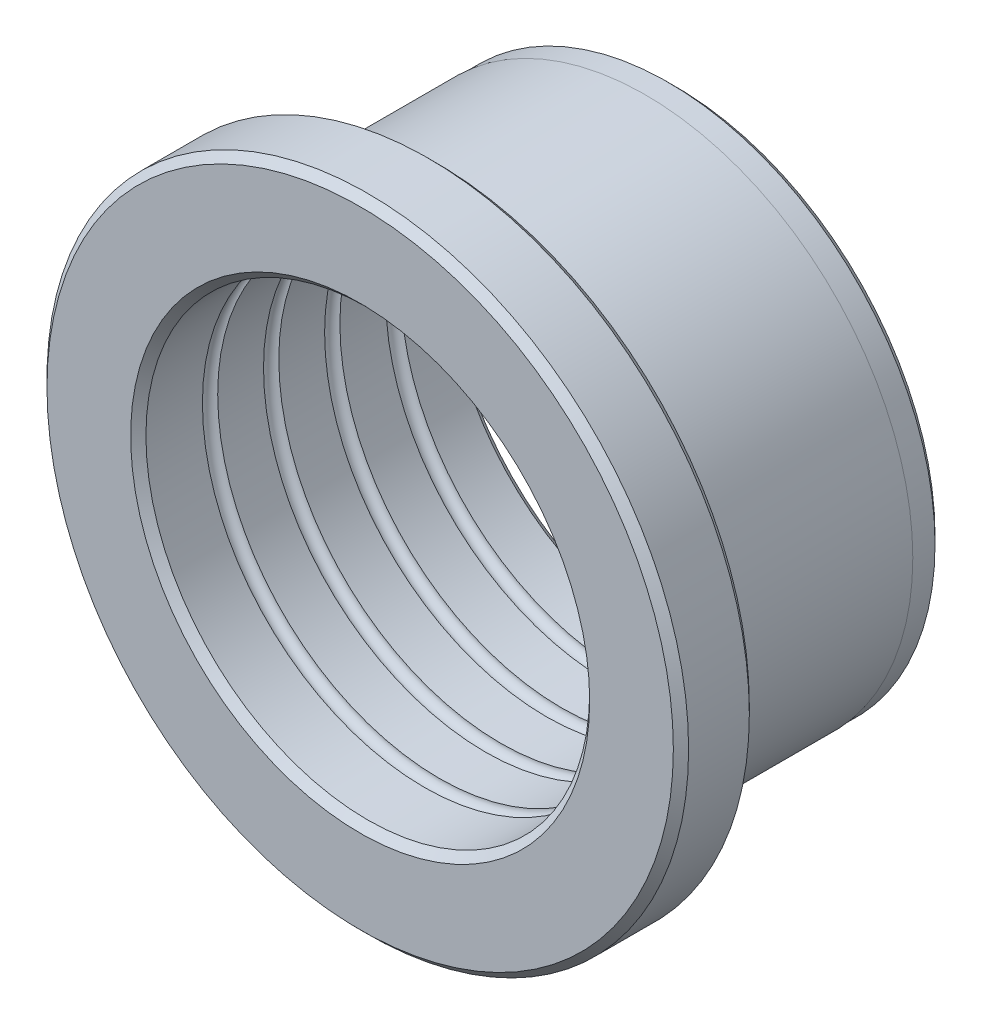
ISO-10303-21;
HEADER;
FILE_DESCRIPTION(('STEP AP214'),'2;1');
FILE_NAME('part.step','',(''),(''),'','','');
FILE_SCHEMA(('AUTOMOTIVE_DESIGN { 1 0 10303 214 1 1 1 1 }'));
ENDSEC;
DATA;
#1=APPLICATION_CONTEXT('core data for automotive mechanical design processes');
#2=APPLICATION_PROTOCOL_DEFINITION('international standard','automotive_design',2000,#1);
#3=PRODUCT_CONTEXT('',#1,'mechanical');
#4=PRODUCT('Part','Part','',(#3));
#5=PRODUCT_RELATED_PRODUCT_CATEGORY('part','',(#4));
#6=PRODUCT_DEFINITION_FORMATION('','',#4);
#7=PRODUCT_DEFINITION_CONTEXT('part definition',#1,'design');
#8=PRODUCT_DEFINITION('design','',#6,#7);
#9=PRODUCT_DEFINITION_SHAPE('','',#8);
#10=(LENGTH_UNIT() NAMED_UNIT(*) SI_UNIT(.MILLI.,.METRE.));
#11=(NAMED_UNIT(*) PLANE_ANGLE_UNIT() SI_UNIT($,.RADIAN.));
#12=(NAMED_UNIT(*) SI_UNIT($,.STERADIAN.) SOLID_ANGLE_UNIT());
#13=UNCERTAINTY_MEASURE_WITH_UNIT(LENGTH_MEASURE(1.E-05),#10,'distance_accuracy_value','');
#14=(GEOMETRIC_REPRESENTATION_CONTEXT(3) GLOBAL_UNCERTAINTY_ASSIGNED_CONTEXT((#13)) GLOBAL_UNIT_ASSIGNED_CONTEXT((#10,
#11,#12)) REPRESENTATION_CONTEXT('',''));
#15=CARTESIAN_POINT('',(0.,0.,0.));
#16=DIRECTION('',(0.,0.,1.));
#17=DIRECTION('',(1.,0.,0.));
#18=AXIS2_PLACEMENT_3D('',#15,#16,#17);
#19=CARTESIAN_POINT('',(0.,0.,-4.7));
#20=DIRECTION('',(0.,0.,1.));
#21=DIRECTION('',(1.,0.,0.));
#22=AXIS2_PLACEMENT_3D('',#19,#20,#21);
#23=TOROIDAL_SURFACE('',#22,14.525,0.5);
#24=CARTESIAN_POINT('',(0.,0.,-5.19999374996094));
#25=DIRECTION('',(0.,0.,1.));
#26=DIRECTION('',(1.,0.,0.));
#27=AXIS2_PLACEMENT_3D('',#24,#25,#26);
#28=CIRCLE('',#27,14.5275);
#29=CARTESIAN_POINT('',(14.5275,0.,-5.19999374996094));
#30=VERTEX_POINT('',#29);
#31=EDGE_CURVE('E109',#30,#30,#28,.T.);
#32=ORIENTED_EDGE('',*,*,#31,.F.);
#33=EDGE_LOOP('',(#32));
#34=FACE_BOUND('',#33,.T.);
#35=CARTESIAN_POINT('',(0.,0.,-4.20000625003906));
#36=DIRECTION('',(0.,0.,1.));
#37=DIRECTION('',(1.,0.,0.));
#38=AXIS2_PLACEMENT_3D('',#35,#36,#37);
#39=CIRCLE('',#38,14.5275);
#40=CARTESIAN_POINT('',(14.5275,0.,-4.20000625003906));
#41=VERTEX_POINT('',#40);
#42=EDGE_CURVE('E10',#41,#41,#39,.T.);
#43=ORIENTED_EDGE('',*,*,#42,.T.);
#44=EDGE_LOOP('',(#43));
#45=FACE_BOUND('',#44,.T.);
#46=ADVANCED_FACE('F39',(#34,#45),#23,.F.);
#47=CARTESIAN_POINT('',(0.,0.,0.));
#48=DIRECTION('',(0.,0.,1.));
#49=DIRECTION('',(1.,0.,0.));
#50=AXIS2_PLACEMENT_3D('',#47,#48,#49);
#51=CYLINDRICAL_SURFACE('',#50,14.5275);
#52=ORIENTED_EDGE('',*,*,#42,.F.);
#53=EDGE_LOOP('',(#52));
#54=FACE_BOUND('',#53,.T.);
#55=CARTESIAN_POINT('',(0.,0.,-0.500000000000001));
#56=DIRECTION('',(0.,0.,1.));
#57=DIRECTION('',(1.,0.,0.));
#58=AXIS2_PLACEMENT_3D('',#55,#56,#57);
#59=CIRCLE('',#58,14.5275);
#60=CARTESIAN_POINT('',(14.5275,0.,-0.500000000000001));
#61=VERTEX_POINT('',#60);
#62=EDGE_CURVE('E45',#61,#61,#59,.T.);
#63=ORIENTED_EDGE('',*,*,#62,.T.);
#64=EDGE_LOOP('',(#63));
#65=FACE_BOUND('',#64,.T.);
#66=ADVANCED_FACE('F116',(#54,#65),#51,.F.);
#67=CARTESIAN_POINT('',(0.,0.,0.));
#68=DIRECTION('',(0.,0.,1.));
#69=DIRECTION('',(1.,0.,0.));
#70=AXIS2_PLACEMENT_3D('',#67,#68,#69);
#71=CONICAL_SURFACE('',#70,15.0275,0.785398163397449);
#72=ORIENTED_EDGE('',*,*,#62,.F.);
#73=EDGE_LOOP('',(#72));
#74=FACE_BOUND('',#73,.T.);
#75=CARTESIAN_POINT('',(0.,0.,0.));
#76=DIRECTION('',(0.,0.,1.));
#77=DIRECTION('',(1.,0.,0.));
#78=AXIS2_PLACEMENT_3D('',#75,#76,#77);
#79=CIRCLE('',#78,15.0275);
#80=CARTESIAN_POINT('',(15.0275,0.,0.));
#81=VERTEX_POINT('',#80);
#82=EDGE_CURVE('E49',#81,#81,#79,.T.);
#83=ORIENTED_EDGE('',*,*,#82,.T.);
#84=EDGE_LOOP('',(#83));
#85=FACE_BOUND('',#84,.T.);
#86=ADVANCED_FACE('F120',(#74,#85),#71,.F.);
#87=CARTESIAN_POINT('',(0.,20.505,0.));
#88=DIRECTION('',(0.,0.,-1.));
#89=DIRECTION('',(-1.,0.,0.));
#90=AXIS2_PLACEMENT_3D('',#87,#88,#89);
#91=PLANE('',#90);
#92=ORIENTED_EDGE('',*,*,#82,.F.);
#93=EDGE_LOOP('',(#92));
#94=FACE_BOUND('',#93,.T.);
#95=CARTESIAN_POINT('',(0.,0.,0.));
#96=DIRECTION('',(0.,0.,1.));
#97=DIRECTION('',(1.,0.,0.));
#98=AXIS2_PLACEMENT_3D('',#95,#96,#97);
#99=CIRCLE('',#98,20.505);
#100=CARTESIAN_POINT('',(20.505,0.,0.));
#101=VERTEX_POINT('',#100);
#102=EDGE_CURVE('E53',#101,#101,#99,.T.);
#103=ORIENTED_EDGE('',*,*,#102,.T.);
#104=EDGE_LOOP('',(#103));
#105=FACE_BOUND('',#104,.T.);
#106=ADVANCED_FACE('F125',(#94,#105),#91,.F.);
#107=CARTESIAN_POINT('',(0.,0.,-0.500000000000002));
#108=DIRECTION('',(0.,0.,-1.));
#109=DIRECTION('',(-1.,0.,0.));
#110=AXIS2_PLACEMENT_3D('',#107,#108,#109);
#111=CONICAL_SURFACE('',#110,21.005,0.785398163397449);
#112=ORIENTED_EDGE('',*,*,#102,.F.);
#113=EDGE_LOOP('',(#112));
#114=FACE_BOUND('',#113,.T.);
#115=CARTESIAN_POINT('',(0.,0.,-0.500000000000002));
#116=DIRECTION('',(0.,0.,1.));
#117=DIRECTION('',(1.,0.,0.));
#118=AXIS2_PLACEMENT_3D('',#115,#116,#117);
#119=CIRCLE('',#118,21.005);
#120=CARTESIAN_POINT('',(21.005,0.,-0.500000000000002));
#121=VERTEX_POINT('',#120);
#122=EDGE_CURVE('E58',#121,#121,#119,.T.);
#123=ORIENTED_EDGE('',*,*,#122,.T.);
#124=EDGE_LOOP('',(#123));
#125=FACE_BOUND('',#124,.T.);
#126=ADVANCED_FACE('F131',(#114,#125),#111,.T.);
#127=CARTESIAN_POINT('',(0.,0.,0.));
#128=DIRECTION('',(0.,0.,1.));
#129=DIRECTION('',(1.,0.,0.));
#130=AXIS2_PLACEMENT_3D('',#127,#128,#129);
#131=CYLINDRICAL_SURFACE('',#130,21.005);
#132=ORIENTED_EDGE('',*,*,#122,.F.);
#133=EDGE_LOOP('',(#132));
#134=FACE_BOUND('',#133,.T.);
#135=CARTESIAN_POINT('',(0.,0.,-4.475));
#136=DIRECTION('',(0.,0.,1.));
#137=DIRECTION('',(1.,0.,0.));
#138=AXIS2_PLACEMENT_3D('',#135,#136,#137);
#139=CIRCLE('',#138,21.005);
#140=CARTESIAN_POINT('',(21.005,0.,-4.475));
#141=VERTEX_POINT('',#140);
#142=EDGE_CURVE('E61',#141,#141,#139,.T.);
#143=ORIENTED_EDGE('',*,*,#142,.T.);
#144=EDGE_LOOP('',(#143));
#145=FACE_BOUND('',#144,.T.);
#146=ADVANCED_FACE('F135',(#134,#145),#131,.T.);
#147=CARTESIAN_POINT('',(0.,0.,-4.975));
#148=DIRECTION('',(0.,0.,1.));
#149=DIRECTION('',(1.,0.,0.));
#150=AXIS2_PLACEMENT_3D('',#147,#148,#149);
#151=CONICAL_SURFACE('',#150,20.505,0.785398163397449);
#152=ORIENTED_EDGE('',*,*,#142,.F.);
#153=EDGE_LOOP('',(#152));
#154=FACE_BOUND('',#153,.T.);
#155=CARTESIAN_POINT('',(0.,0.,-4.975));
#156=DIRECTION('',(0.,0.,1.));
#157=DIRECTION('',(1.,0.,0.));
#158=AXIS2_PLACEMENT_3D('',#155,#156,#157);
#159=CIRCLE('',#158,20.505);
#160=CARTESIAN_POINT('',(20.505,0.,-4.975));
#161=VERTEX_POINT('',#160);
#162=EDGE_CURVE('E64',#161,#161,#159,.T.);
#163=ORIENTED_EDGE('',*,*,#162,.T.);
#164=EDGE_LOOP('',(#163));
#165=FACE_BOUND('',#164,.T.);
#166=ADVANCED_FACE('F139',(#154,#165),#151,.T.);
#167=CARTESIAN_POINT('',(0.,17.9075,-4.975));
#168=DIRECTION('',(0.,0.,1.));
#169=DIRECTION('',(1.,0.,0.));
#170=AXIS2_PLACEMENT_3D('',#167,#168,#169);
#171=PLANE('',#170);
#172=ORIENTED_EDGE('',*,*,#162,.F.);
#173=EDGE_LOOP('',(#172));
#174=FACE_BOUND('',#173,.T.);
#175=CARTESIAN_POINT('',(0.,0.,-4.975));
#176=DIRECTION('',(0.,0.,1.));
#177=DIRECTION('',(1.,0.,0.));
#178=AXIS2_PLACEMENT_3D('',#175,#176,#177);
#179=CIRCLE('',#178,17.9075);
#180=CARTESIAN_POINT('',(17.9075,0.,-4.975));
#181=VERTEX_POINT('',#180);
#182=EDGE_CURVE('E67',#181,#181,#179,.T.);
#183=ORIENTED_EDGE('',*,*,#182,.T.);
#184=EDGE_LOOP('',(#183));
#185=FACE_BOUND('',#184,.T.);
#186=ADVANCED_FACE('F143',(#174,#185),#171,.F.);
#187=CARTESIAN_POINT('',(0.,0.,-5.375));
#188=DIRECTION('',(0.,0.,1.));
#189=DIRECTION('',(1.,0.,0.));
#190=AXIS2_PLACEMENT_3D('',#187,#188,#189);
#191=TOROIDAL_SURFACE('',#190,17.9075,0.400000000000001);
#192=ORIENTED_EDGE('',*,*,#182,.F.);
#193=EDGE_LOOP('',(#192));
#194=FACE_BOUND('',#193,.T.);
#195=CARTESIAN_POINT('',(0.,0.,-5.375));
#196=DIRECTION('',(0.,0.,1.));
#197=DIRECTION('',(1.,0.,0.));
#198=AXIS2_PLACEMENT_3D('',#195,#196,#197);
#199=CIRCLE('',#198,17.5075);
#200=CARTESIAN_POINT('',(17.5075,0.,-5.375));
#201=VERTEX_POINT('',#200);
#202=EDGE_CURVE('E70',#201,#201,#199,.T.);
#203=ORIENTED_EDGE('',*,*,#202,.T.);
#204=EDGE_LOOP('',(#203));
#205=FACE_BOUND('',#204,.T.);
#206=ADVANCED_FACE('F147',(#194,#205),#191,.F.);
#207=CARTESIAN_POINT('',(0.,0.,0.));
#208=DIRECTION('',(0.,0.,1.));
#209=DIRECTION('',(1.,0.,0.));
#210=AXIS2_PLACEMENT_3D('',#207,#208,#209);
#211=CYLINDRICAL_SURFACE('',#210,17.5075);
#212=ORIENTED_EDGE('',*,*,#202,.F.);
#213=EDGE_LOOP('',(#212));
#214=FACE_BOUND('',#213,.T.);
#215=CARTESIAN_POINT('',(0.,0.,-18.675));
#216=DIRECTION('',(0.,0.,1.));
#217=DIRECTION('',(1.,0.,0.));
#218=AXIS2_PLACEMENT_3D('',#215,#216,#217);
#219=CIRCLE('',#218,17.5075);
#220=CARTESIAN_POINT('',(17.5075,0.,-18.675));
#221=VERTEX_POINT('',#220);
#222=EDGE_CURVE('E73',#221,#221,#219,.T.);
#223=ORIENTED_EDGE('',*,*,#222,.T.);
#224=EDGE_LOOP('',(#223));
#225=FACE_BOUND('',#224,.T.);
#226=ADVANCED_FACE('F151',(#214,#225),#211,.T.);
#227=CARTESIAN_POINT('',(0.,17.4625,-18.675));
#228=DIRECTION('',(0.,0.,1.));
#229=DIRECTION('',(1.,0.,0.));
#230=AXIS2_PLACEMENT_3D('',#227,#228,#229);
#231=PLANE('',#230);
#232=ORIENTED_EDGE('',*,*,#222,.F.);
#233=EDGE_LOOP('',(#232));
#234=FACE_BOUND('',#233,.T.);
#235=CARTESIAN_POINT('',(0.,0.,-18.675));
#236=DIRECTION('',(0.,0.,1.));
#237=DIRECTION('',(1.,0.,0.));
#238=AXIS2_PLACEMENT_3D('',#235,#236,#237);
#239=CIRCLE('',#238,17.4625);
#240=CARTESIAN_POINT('',(17.4625,0.,-18.675));
#241=VERTEX_POINT('',#240);
#242=EDGE_CURVE('E76',#241,#241,#239,.T.);
#243=ORIENTED_EDGE('',*,*,#242,.T.);
#244=EDGE_LOOP('',(#243));
#245=FACE_BOUND('',#244,.T.);
#246=ADVANCED_FACE('F155',(#234,#245),#231,.F.);
#247=CARTESIAN_POINT('',(0.,0.,0.));
#248=DIRECTION('',(0.,0.,1.));
#249=DIRECTION('',(1.,0.,0.));
#250=AXIS2_PLACEMENT_3D('',#247,#248,#249);
#251=CYLINDRICAL_SURFACE('',#250,17.4625);
#252=ORIENTED_EDGE('',*,*,#242,.F.);
#253=EDGE_LOOP('',(#252));
#254=FACE_BOUND('',#253,.T.);
#255=CARTESIAN_POINT('',(0.,0.,-20.175));
#256=DIRECTION('',(0.,0.,1.));
#257=DIRECTION('',(1.,0.,0.));
#258=AXIS2_PLACEMENT_3D('',#255,#256,#257);
#259=CIRCLE('',#258,17.4625);
#260=CARTESIAN_POINT('',(17.4625,0.,-20.175));
#261=VERTEX_POINT('',#260);
#262=EDGE_CURVE('E79',#261,#261,#259,.T.);
#263=ORIENTED_EDGE('',*,*,#262,.T.);
#264=EDGE_LOOP('',(#263));
#265=FACE_BOUND('',#264,.T.);
#266=ADVANCED_FACE('F159',(#254,#265),#251,.T.);
#267=CARTESIAN_POINT('',(0.,0.,-20.675));
#268=DIRECTION('',(0.,0.,1.));
#269=DIRECTION('',(1.,0.,0.));
#270=AXIS2_PLACEMENT_3D('',#267,#268,#269);
#271=CONICAL_SURFACE('',#270,16.9625,0.785398163397448);
#272=ORIENTED_EDGE('',*,*,#262,.F.);
#273=EDGE_LOOP('',(#272));
#274=FACE_BOUND('',#273,.T.);
#275=CARTESIAN_POINT('',(0.,0.,-20.675));
#276=DIRECTION('',(0.,0.,1.));
#277=DIRECTION('',(1.,0.,0.));
#278=AXIS2_PLACEMENT_3D('',#275,#276,#277);
#279=CIRCLE('',#278,16.9625);
#280=CARTESIAN_POINT('',(16.9625,0.,-20.675));
#281=VERTEX_POINT('',#280);
#282=EDGE_CURVE('E82',#281,#281,#279,.T.);
#283=ORIENTED_EDGE('',*,*,#282,.T.);
#284=EDGE_LOOP('',(#283));
#285=FACE_BOUND('',#284,.T.);
#286=ADVANCED_FACE('F163',(#274,#285),#271,.T.);
#287=CARTESIAN_POINT('',(0.,15.0275,-20.675));
#288=DIRECTION('',(0.,0.,1.));
#289=DIRECTION('',(1.,0.,0.));
#290=AXIS2_PLACEMENT_3D('',#287,#288,#289);
#291=PLANE('',#290);
#292=ORIENTED_EDGE('',*,*,#282,.F.);
#293=EDGE_LOOP('',(#292));
#294=FACE_BOUND('',#293,.T.);
#295=CARTESIAN_POINT('',(0.,0.,-20.675));
#296=DIRECTION('',(0.,0.,1.));
#297=DIRECTION('',(1.,0.,0.));
#298=AXIS2_PLACEMENT_3D('',#295,#296,#297);
#299=CIRCLE('',#298,15.0275);
#300=CARTESIAN_POINT('',(15.0275,0.,-20.675));
#301=VERTEX_POINT('',#300);
#302=EDGE_CURVE('E85',#301,#301,#299,.T.);
#303=ORIENTED_EDGE('',*,*,#302,.T.);
#304=EDGE_LOOP('',(#303));
#305=FACE_BOUND('',#304,.T.);
#306=ADVANCED_FACE('F167',(#294,#305),#291,.F.);
#307=CARTESIAN_POINT('',(0.,0.,-20.175));
#308=DIRECTION('',(0.,0.,-1.));
#309=DIRECTION('',(-1.,0.,0.));
#310=AXIS2_PLACEMENT_3D('',#307,#308,#309);
#311=CONICAL_SURFACE('',#310,14.5275,0.785398163397448);
#312=ORIENTED_EDGE('',*,*,#302,.F.);
#313=EDGE_LOOP('',(#312));
#314=FACE_BOUND('',#313,.T.);
#315=CARTESIAN_POINT('',(0.,0.,-20.175));
#316=DIRECTION('',(0.,0.,1.));
#317=DIRECTION('',(1.,0.,0.));
#318=AXIS2_PLACEMENT_3D('',#315,#316,#317);
#319=CIRCLE('',#318,14.5275);
#320=CARTESIAN_POINT('',(14.5275,0.,-20.175));
#321=VERTEX_POINT('',#320);
#322=EDGE_CURVE('E88',#321,#321,#319,.T.);
#323=ORIENTED_EDGE('',*,*,#322,.T.);
#324=EDGE_LOOP('',(#323));
#325=FACE_BOUND('',#324,.T.);
#326=ADVANCED_FACE('F171',(#314,#325),#311,.F.);
#327=CARTESIAN_POINT('',(0.,0.,0.));
#328=DIRECTION('',(0.,0.,1.));
#329=DIRECTION('',(1.,0.,0.));
#330=AXIS2_PLACEMENT_3D('',#327,#328,#329);
#331=CYLINDRICAL_SURFACE('',#330,14.5275);
#332=ORIENTED_EDGE('',*,*,#322,.F.);
#333=EDGE_LOOP('',(#332));
#334=FACE_BOUND('',#333,.T.);
#335=CARTESIAN_POINT('',(0.,0.,-17.1999937499609));
#336=DIRECTION('',(0.,0.,1.));
#337=DIRECTION('',(1.,0.,0.));
#338=AXIS2_PLACEMENT_3D('',#335,#336,#337);
#339=CIRCLE('',#338,14.5275);
#340=CARTESIAN_POINT('',(14.5275,0.,-17.1999937499609));
#341=VERTEX_POINT('',#340);
#342=EDGE_CURVE('E91',#341,#341,#339,.T.);
#343=ORIENTED_EDGE('',*,*,#342,.T.);
#344=EDGE_LOOP('',(#343));
#345=FACE_BOUND('',#344,.T.);
#346=ADVANCED_FACE('F175',(#334,#345),#331,.F.);
#347=CARTESIAN_POINT('',(0.,0.,-16.7));
#348=DIRECTION('',(0.,0.,1.));
#349=DIRECTION('',(1.,0.,0.));
#350=AXIS2_PLACEMENT_3D('',#347,#348,#349);
#351=TOROIDAL_SURFACE('',#350,14.525,0.499999999999999);
#352=ORIENTED_EDGE('',*,*,#342,.F.);
#353=EDGE_LOOP('',(#352));
#354=FACE_BOUND('',#353,.T.);
#355=CARTESIAN_POINT('',(0.,0.,-16.2000062500391));
#356=DIRECTION('',(0.,0.,1.));
#357=DIRECTION('',(1.,0.,0.));
#358=AXIS2_PLACEMENT_3D('',#355,#356,#357);
#359=CIRCLE('',#358,14.5275);
#360=CARTESIAN_POINT('',(14.5275,0.,-16.2000062500391));
#361=VERTEX_POINT('',#360);
#362=EDGE_CURVE('E94',#361,#361,#359,.T.);
#363=ORIENTED_EDGE('',*,*,#362,.T.);
#364=EDGE_LOOP('',(#363));
#365=FACE_BOUND('',#364,.T.);
#366=ADVANCED_FACE('F179',(#354,#365),#351,.F.);
#367=CARTESIAN_POINT('',(0.,0.,0.));
#368=DIRECTION('',(0.,0.,1.));
#369=DIRECTION('',(1.,0.,0.));
#370=AXIS2_PLACEMENT_3D('',#367,#368,#369);
#371=CYLINDRICAL_SURFACE('',#370,14.5275);
#372=ORIENTED_EDGE('',*,*,#362,.F.);
#373=EDGE_LOOP('',(#372));
#374=FACE_BOUND('',#373,.T.);
#375=CARTESIAN_POINT('',(0.,0.,-13.1999937499609));
#376=DIRECTION('',(0.,0.,1.));
#377=DIRECTION('',(1.,0.,0.));
#378=AXIS2_PLACEMENT_3D('',#375,#376,#377);
#379=CIRCLE('',#378,14.5275);
#380=CARTESIAN_POINT('',(14.5275,0.,-13.1999937499609));
#381=VERTEX_POINT('',#380);
#382=EDGE_CURVE('E97',#381,#381,#379,.T.);
#383=ORIENTED_EDGE('',*,*,#382,.T.);
#384=EDGE_LOOP('',(#383));
#385=FACE_BOUND('',#384,.T.);
#386=ADVANCED_FACE('F183',(#374,#385),#371,.F.);
#387=CARTESIAN_POINT('',(0.,0.,-12.7));
#388=DIRECTION('',(0.,0.,1.));
#389=DIRECTION('',(1.,0.,0.));
#390=AXIS2_PLACEMENT_3D('',#387,#388,#389);
#391=TOROIDAL_SURFACE('',#390,14.525,0.499999999999999);
#392=ORIENTED_EDGE('',*,*,#382,.F.);
#393=EDGE_LOOP('',(#392));
#394=FACE_BOUND('',#393,.T.);
#395=CARTESIAN_POINT('',(0.,0.,-12.2000062500391));
#396=DIRECTION('',(0.,0.,1.));
#397=DIRECTION('',(1.,0.,0.));
#398=AXIS2_PLACEMENT_3D('',#395,#396,#397);
#399=CIRCLE('',#398,14.5275);
#400=CARTESIAN_POINT('',(14.5275,0.,-12.2000062500391));
#401=VERTEX_POINT('',#400);
#402=EDGE_CURVE('E100',#401,#401,#399,.T.);
#403=ORIENTED_EDGE('',*,*,#402,.T.);
#404=EDGE_LOOP('',(#403));
#405=FACE_BOUND('',#404,.T.);
#406=ADVANCED_FACE('F187',(#394,#405),#391,.F.);
#407=CARTESIAN_POINT('',(0.,0.,0.));
#408=DIRECTION('',(0.,0.,1.));
#409=DIRECTION('',(1.,0.,0.));
#410=AXIS2_PLACEMENT_3D('',#407,#408,#409);
#411=CYLINDRICAL_SURFACE('',#410,14.5275);
#412=ORIENTED_EDGE('',*,*,#402,.F.);
#413=EDGE_LOOP('',(#412));
#414=FACE_BOUND('',#413,.T.);
#415=CARTESIAN_POINT('',(0.,0.,-9.19999374996094));
#416=DIRECTION('',(0.,0.,1.));
#417=DIRECTION('',(1.,0.,0.));
#418=AXIS2_PLACEMENT_3D('',#415,#416,#417);
#419=CIRCLE('',#418,14.5275);
#420=CARTESIAN_POINT('',(14.5275,0.,-9.19999374996094));
#421=VERTEX_POINT('',#420);
#422=EDGE_CURVE('E103',#421,#421,#419,.T.);
#423=ORIENTED_EDGE('',*,*,#422,.T.);
#424=EDGE_LOOP('',(#423));
#425=FACE_BOUND('',#424,.T.);
#426=ADVANCED_FACE('F191',(#414,#425),#411,.F.);
#427=CARTESIAN_POINT('',(0.,0.,-8.7));
#428=DIRECTION('',(0.,0.,1.));
#429=DIRECTION('',(1.,0.,0.));
#430=AXIS2_PLACEMENT_3D('',#427,#428,#429);
#431=TOROIDAL_SURFACE('',#430,14.525,0.499999999999999);
#432=ORIENTED_EDGE('',*,*,#422,.F.);
#433=EDGE_LOOP('',(#432));
#434=FACE_BOUND('',#433,.T.);
#435=CARTESIAN_POINT('',(0.,0.,-8.20000625003907));
#436=DIRECTION('',(0.,0.,1.));
#437=DIRECTION('',(1.,0.,0.));
#438=AXIS2_PLACEMENT_3D('',#435,#436,#437);
#439=CIRCLE('',#438,14.5275);
#440=CARTESIAN_POINT('',(14.5275,0.,-8.20000625003907));
#441=VERTEX_POINT('',#440);
#442=EDGE_CURVE('E106',#441,#441,#439,.T.);
#443=ORIENTED_EDGE('',*,*,#442,.T.);
#444=EDGE_LOOP('',(#443));
#445=FACE_BOUND('',#444,.T.);
#446=ADVANCED_FACE('F195',(#434,#445),#431,.F.);
#447=CARTESIAN_POINT('',(0.,0.,0.));
#448=DIRECTION('',(0.,0.,1.));
#449=DIRECTION('',(1.,0.,0.));
#450=AXIS2_PLACEMENT_3D('',#447,#448,#449);
#451=CYLINDRICAL_SURFACE('',#450,14.5275);
#452=ORIENTED_EDGE('',*,*,#442,.F.);
#453=EDGE_LOOP('',(#452));
#454=FACE_BOUND('',#453,.T.);
#455=ORIENTED_EDGE('',*,*,#31,.T.);
#456=EDGE_LOOP('',(#455));
#457=FACE_BOUND('',#456,.T.);
#458=ADVANCED_FACE('F113',(#454,#457),#451,.F.);
#459=CLOSED_SHELL('',(#46,#66,#86,#106,#126,#146,#166,#186,#206,#226,#246,#266,#286,#306,#326,
#346,#366,#386,#406,#426,#446,#458));
#460=MANIFOLD_SOLID_BREP('B2',#459);
#461=ADVANCED_BREP_SHAPE_REPRESENTATION('',(#18,#460),#14);
#462=SHAPE_DEFINITION_REPRESENTATION(#9,#461);
ENDSEC;
END-ISO-10303-21;
